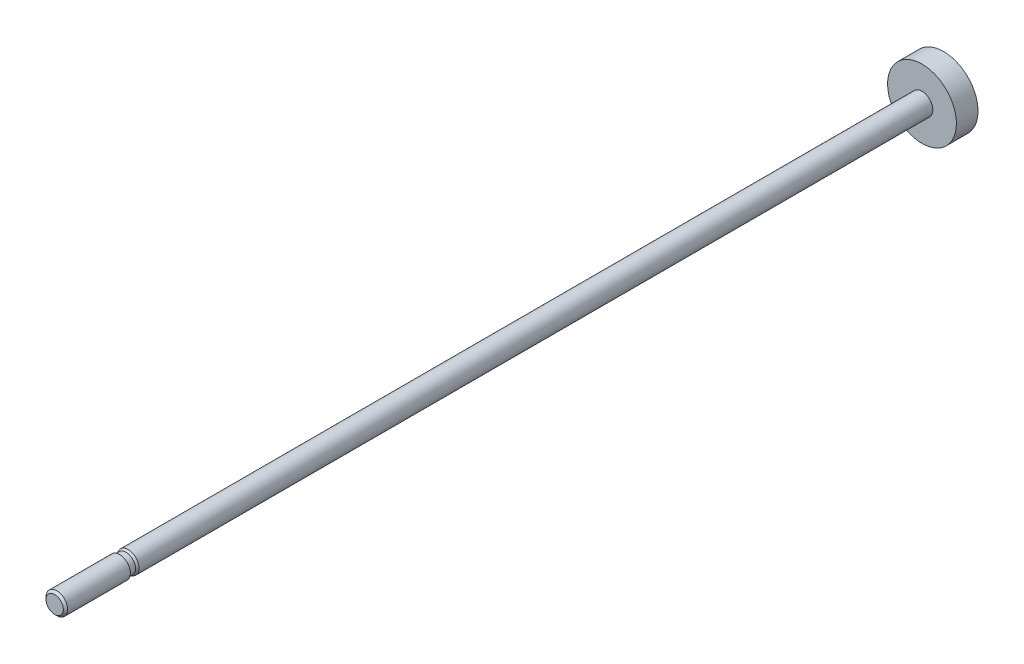
ISO-10303-21;
HEADER;
FILE_DESCRIPTION(('STEP AP214'),'2;1');
FILE_NAME('part.step','',(''),(''),'','','');
FILE_SCHEMA(('AUTOMOTIVE_DESIGN { 1 0 10303 214 1 1 1 1 }'));
ENDSEC;
DATA;
#1=APPLICATION_CONTEXT('core data for automotive mechanical design processes');
#2=APPLICATION_PROTOCOL_DEFINITION('international standard','automotive_design',2000,#1);
#3=PRODUCT_CONTEXT('',#1,'mechanical');
#4=PRODUCT('Part','Part','',(#3));
#5=PRODUCT_RELATED_PRODUCT_CATEGORY('part','',(#4));
#6=PRODUCT_DEFINITION_FORMATION('','',#4);
#7=PRODUCT_DEFINITION_CONTEXT('part definition',#1,'design');
#8=PRODUCT_DEFINITION('design','',#6,#7);
#9=PRODUCT_DEFINITION_SHAPE('','',#8);
#10=(LENGTH_UNIT() NAMED_UNIT(*) SI_UNIT(.MILLI.,.METRE.));
#11=(NAMED_UNIT(*) PLANE_ANGLE_UNIT() SI_UNIT($,.RADIAN.));
#12=(NAMED_UNIT(*) SI_UNIT($,.STERADIAN.) SOLID_ANGLE_UNIT());
#13=UNCERTAINTY_MEASURE_WITH_UNIT(LENGTH_MEASURE(1.E-05),#10,'distance_accuracy_value','');
#14=(GEOMETRIC_REPRESENTATION_CONTEXT(3) GLOBAL_UNCERTAINTY_ASSIGNED_CONTEXT((#13)) GLOBAL_UNIT_ASSIGNED_CONTEXT((#10,
#11,#12)) REPRESENTATION_CONTEXT('',''));
#15=CARTESIAN_POINT('',(0.,0.,0.));
#16=DIRECTION('',(0.,0.,1.));
#17=DIRECTION('',(1.,0.,0.));
#18=AXIS2_PLACEMENT_3D('',#15,#16,#17);
#19=CARTESIAN_POINT('',(-8.0454,-8.0454,-2.5));
#20=DIRECTION('',(0.,0.,1.));
#21=DIRECTION('',(1.,0.,0.));
#22=AXIS2_PLACEMENT_3D('',#19,#20,#21);
#23=PLANE('',#22);
#24=CARTESIAN_POINT('',(0.,0.,-2.5));
#25=DIRECTION('',(0.,0.,-1.));
#26=DIRECTION('',(0.,1.,0.));
#27=AXIS2_PLACEMENT_3D('',#24,#25,#26);
#28=CIRCLE('',#27,7.95);
#29=CARTESIAN_POINT('',(0.,7.95,-2.5));
#30=VERTEX_POINT('',#29);
#31=EDGE_CURVE('E19',#30,#30,#28,.T.);
#32=ORIENTED_EDGE('',*,*,#31,.T.);
#33=EDGE_LOOP('',(#32));
#34=FACE_BOUND('',#33,.T.);
#35=ADVANCED_FACE('F15',(#34),#23,.F.);
#36=CARTESIAN_POINT('',(0.,0.,2.5));
#37=DIRECTION('',(0.,0.,-1.));
#38=DIRECTION('',(0.,1.,0.));
#39=AXIS2_PLACEMENT_3D('',#36,#37,#38);
#40=CYLINDRICAL_SURFACE('',#39,7.95);
#41=ORIENTED_EDGE('',*,*,#31,.F.);
#42=EDGE_LOOP('',(#41));
#43=FACE_BOUND('',#42,.T.);
#44=CARTESIAN_POINT('',(0.,0.,2.5));
#45=DIRECTION('',(0.,0.,-1.));
#46=DIRECTION('',(0.,1.,0.));
#47=AXIS2_PLACEMENT_3D('',#44,#45,#46);
#48=CIRCLE('',#47,7.95);
#49=CARTESIAN_POINT('',(0.,7.95,2.5));
#50=VERTEX_POINT('',#49);
#51=EDGE_CURVE('E44',#50,#50,#48,.F.);
#52=ORIENTED_EDGE('',*,*,#51,.F.);
#53=EDGE_LOOP('',(#52));
#54=FACE_BOUND('',#53,.T.);
#55=ADVANCED_FACE('F52',(#43,#54),#40,.T.);
#56=CARTESIAN_POINT('',(-8.0454,-8.0454,2.5));
#57=DIRECTION('',(0.,0.,1.));
#58=DIRECTION('',(1.,0.,0.));
#59=AXIS2_PLACEMENT_3D('',#56,#57,#58);
#60=PLANE('',#59);
#61=CARTESIAN_POINT('',(0.,0.,2.5));
#62=DIRECTION('',(0.,0.,-1.));
#63=DIRECTION('',(-1.,0.,0.));
#64=AXIS2_PLACEMENT_3D('',#61,#62,#63);
#65=CIRCLE('',#64,2.5);
#66=CARTESIAN_POINT('',(-2.5,0.,2.5));
#67=VERTEX_POINT('',#66);
#68=EDGE_CURVE('E37',#67,#67,#65,.T.);
#69=ORIENTED_EDGE('',*,*,#68,.T.);
#70=EDGE_LOOP('',(#69));
#71=FACE_BOUND('',#70,.T.);
#72=ORIENTED_EDGE('',*,*,#51,.T.);
#73=EDGE_LOOP('',(#72));
#74=FACE_BOUND('',#73,.T.);
#75=ADVANCED_FACE('F55',(#71,#74),#60,.T.);
#76=CARTESIAN_POINT('',(0.,0.,186.00636552));
#77=DIRECTION('',(0.,0.,-1.));
#78=DIRECTION('',(-1.,0.,0.));
#79=AXIS2_PLACEMENT_3D('',#76,#77,#78);
#80=CYLINDRICAL_SURFACE('',#79,2.5);
#81=ORIENTED_EDGE('',*,*,#68,.F.);
#82=EDGE_LOOP('',(#81));
#83=FACE_BOUND('',#82,.T.);
#84=CARTESIAN_POINT('',(0.,0.,186.00636552));
#85=DIRECTION('',(0.,0.,-1.));
#86=DIRECTION('',(-1.,0.,0.));
#87=AXIS2_PLACEMENT_3D('',#84,#85,#86);
#88=CIRCLE('',#87,2.5);
#89=CARTESIAN_POINT('',(-2.5,0.,186.00636552));
#90=VERTEX_POINT('',#89);
#91=EDGE_CURVE('E35',#90,#90,#88,.T.);
#92=ORIENTED_EDGE('',*,*,#91,.T.);
#93=EDGE_LOOP('',(#92));
#94=FACE_BOUND('',#93,.T.);
#95=ADVANCED_FACE('F62',(#83,#94),#80,.T.);
#96=CARTESIAN_POINT('',(0.,0.,186.5));
#97=DIRECTION('',(0.,0.,-1.));
#98=DIRECTION('',(-1.,0.,0.));
#99=AXIS2_PLACEMENT_3D('',#96,#97,#98);
#100=CONICAL_SURFACE('',#99,2.215,0.523598775736104);
#101=ORIENTED_EDGE('',*,*,#91,.F.);
#102=EDGE_LOOP('',(#101));
#103=FACE_BOUND('',#102,.T.);
#104=CARTESIAN_POINT('',(0.,0.,186.5));
#105=DIRECTION('',(0.,0.,-1.));
#106=DIRECTION('',(-1.,0.,0.));
#107=AXIS2_PLACEMENT_3D('',#104,#105,#106);
#108=CIRCLE('',#107,2.215);
#109=CARTESIAN_POINT('',(-2.215,0.,186.5));
#110=VERTEX_POINT('',#109);
#111=EDGE_CURVE('E31',#110,#110,#108,.T.);
#112=ORIENTED_EDGE('',*,*,#111,.T.);
#113=EDGE_LOOP('',(#112));
#114=FACE_BOUND('',#113,.T.);
#115=ADVANCED_FACE('F85',(#103,#114),#100,.T.);
#116=CARTESIAN_POINT('',(0.,0.,188.));
#117=DIRECTION('',(0.,0.,-1.));
#118=DIRECTION('',(-1.,0.,0.));
#119=AXIS2_PLACEMENT_3D('',#116,#117,#118);
#120=CYLINDRICAL_SURFACE('',#119,2.215);
#121=ORIENTED_EDGE('',*,*,#111,.F.);
#122=EDGE_LOOP('',(#121));
#123=FACE_BOUND('',#122,.T.);
#124=CARTESIAN_POINT('',(0.,0.,188.));
#125=DIRECTION('',(0.,0.,-1.));
#126=DIRECTION('',(-1.,0.,0.));
#127=AXIS2_PLACEMENT_3D('',#124,#125,#126);
#128=CIRCLE('',#127,2.215);
#129=CARTESIAN_POINT('',(-2.215,0.,188.));
#130=VERTEX_POINT('',#129);
#131=EDGE_CURVE('E34',#130,#130,#128,.T.);
#132=ORIENTED_EDGE('',*,*,#131,.T.);
#133=EDGE_LOOP('',(#132));
#134=FACE_BOUND('',#133,.T.);
#135=ADVANCED_FACE('F81',(#123,#134),#120,.T.);
#136=CARTESIAN_POINT('',(2.024,-2.024,203.));
#137=DIRECTION('',(0.,0.,-1.));
#138=DIRECTION('',(-1.,0.,0.));
#139=AXIS2_PLACEMENT_3D('',#136,#137,#138);
#140=PLANE('',#139);
#141=CARTESIAN_POINT('',(0.,0.,203.));
#142=DIRECTION('',(0.,0.,-1.));
#143=DIRECTION('',(-1.,0.,0.));
#144=AXIS2_PLACEMENT_3D('',#141,#142,#143);
#145=CIRCLE('',#144,1.99999999999994);
#146=CARTESIAN_POINT('',(-1.99999999999994,0.,203.));
#147=VERTEX_POINT('',#146);
#148=EDGE_CURVE('E28',#147,#147,#145,.F.);
#149=ORIENTED_EDGE('',*,*,#148,.T.);
#150=EDGE_LOOP('',(#149));
#151=FACE_BOUND('',#150,.T.);
#152=ADVANCED_FACE('F84',(#151),#140,.F.);
#153=CARTESIAN_POINT('',(-2.53,-2.53,188.));
#154=DIRECTION('',(0.,0.,1.));
#155=DIRECTION('',(1.,0.,0.));
#156=AXIS2_PLACEMENT_3D('',#153,#154,#155);
#157=PLANE('',#156);
#158=ORIENTED_EDGE('',*,*,#131,.F.);
#159=EDGE_LOOP('',(#158));
#160=FACE_BOUND('',#159,.T.);
#161=CARTESIAN_POINT('',(0.,0.,188.));
#162=DIRECTION('',(0.,0.,-1.));
#163=DIRECTION('',(-1.,0.,0.));
#164=AXIS2_PLACEMENT_3D('',#161,#162,#163);
#165=CIRCLE('',#164,2.5);
#166=CARTESIAN_POINT('',(-2.5,0.,188.));
#167=VERTEX_POINT('',#166);
#168=EDGE_CURVE('E23',#167,#167,#165,.T.);
#169=ORIENTED_EDGE('',*,*,#168,.T.);
#170=EDGE_LOOP('',(#169));
#171=FACE_BOUND('',#170,.T.);
#172=ADVANCED_FACE('F17',(#160,#171),#157,.F.);
#173=CARTESIAN_POINT('',(0.,0.,203.));
#174=DIRECTION('',(0.,0.,-1.));
#175=DIRECTION('',(-1.,0.,0.));
#176=AXIS2_PLACEMENT_3D('',#173,#174,#175);
#177=CONICAL_SURFACE('',#176,2.,0.785398163397448);
#178=ORIENTED_EDGE('',*,*,#148,.F.);
#179=EDGE_LOOP('',(#178));
#180=FACE_BOUND('',#179,.T.);
#181=CARTESIAN_POINT('',(0.,0.,202.5));
#182=DIRECTION('',(0.,0.,-1.));
#183=DIRECTION('',(-1.,0.,0.));
#184=AXIS2_PLACEMENT_3D('',#181,#182,#183);
#185=CIRCLE('',#184,2.5);
#186=CARTESIAN_POINT('',(-2.5,0.,202.5));
#187=VERTEX_POINT('',#186);
#188=EDGE_CURVE('E10',#187,#187,#185,.F.);
#189=ORIENTED_EDGE('',*,*,#188,.T.);
#190=EDGE_LOOP('',(#189));
#191=FACE_BOUND('',#190,.T.);
#192=ADVANCED_FACE('F70',(#180,#191),#177,.T.);
#193=CARTESIAN_POINT('',(0.,0.,202.5));
#194=DIRECTION('',(0.,0.,-1.));
#195=DIRECTION('',(-1.,0.,0.));
#196=AXIS2_PLACEMENT_3D('',#193,#194,#195);
#197=CYLINDRICAL_SURFACE('',#196,2.5);
#198=ORIENTED_EDGE('',*,*,#168,.F.);
#199=EDGE_LOOP('',(#198));
#200=FACE_BOUND('',#199,.T.);
#201=ORIENTED_EDGE('',*,*,#188,.F.);
#202=EDGE_LOOP('',(#201));
#203=FACE_BOUND('',#202,.T.);
#204=ADVANCED_FACE('F68',(#200,#203),#197,.T.);
#205=CLOSED_SHELL('',(#35,#55,#75,#95,#115,#135,#152,#172,#192,#204));
#206=MANIFOLD_SOLID_BREP('B1',#205);
#207=ADVANCED_BREP_SHAPE_REPRESENTATION('',(#18,#206),#14);
#208=SHAPE_DEFINITION_REPRESENTATION(#9,#207);
ENDSEC;
END-ISO-10303-21;
